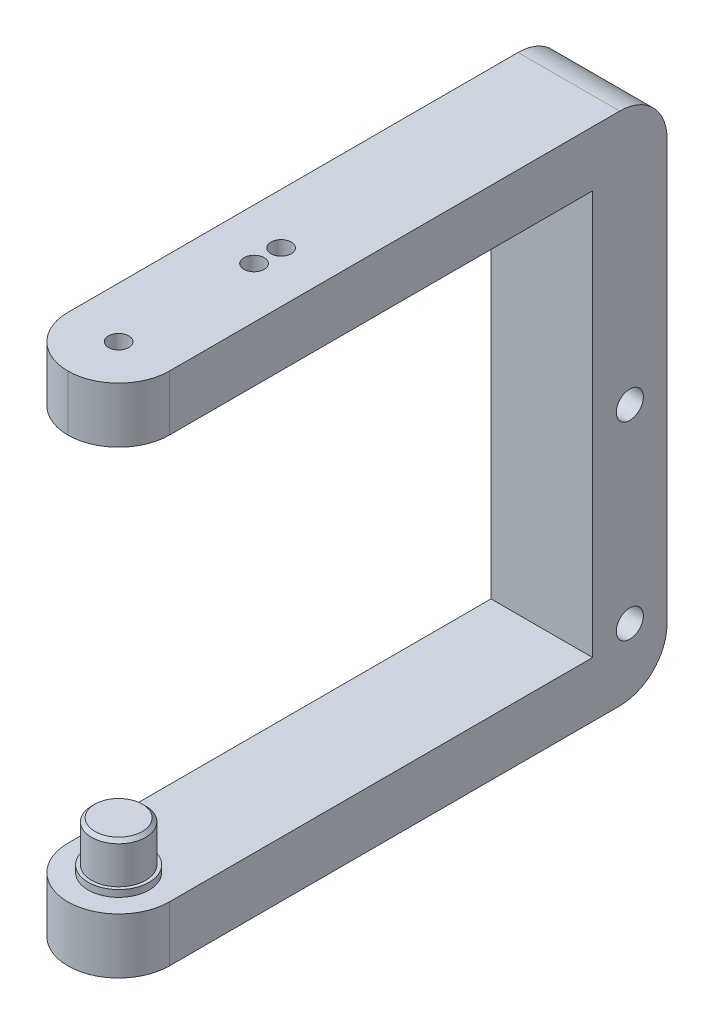
ISO-10303-21;
HEADER;
FILE_DESCRIPTION(('STEP AP214'),'2;1');
FILE_NAME('part.step','',(''),(''),'','','');
FILE_SCHEMA(('AUTOMOTIVE_DESIGN { 1 0 10303 214 1 1 1 1 }'));
ENDSEC;
DATA;
#1=APPLICATION_CONTEXT('core data for automotive mechanical design processes');
#2=APPLICATION_PROTOCOL_DEFINITION('international standard','automotive_design',2000,#1);
#3=PRODUCT_CONTEXT('',#1,'mechanical');
#4=PRODUCT('Part','Part','',(#3));
#5=PRODUCT_RELATED_PRODUCT_CATEGORY('part','',(#4));
#6=PRODUCT_DEFINITION_FORMATION('','',#4);
#7=PRODUCT_DEFINITION_CONTEXT('part definition',#1,'design');
#8=PRODUCT_DEFINITION('design','',#6,#7);
#9=PRODUCT_DEFINITION_SHAPE('','',#8);
#10=(LENGTH_UNIT() NAMED_UNIT(*) SI_UNIT(.MILLI.,.METRE.));
#11=(NAMED_UNIT(*) PLANE_ANGLE_UNIT() SI_UNIT($,.RADIAN.));
#12=(NAMED_UNIT(*) SI_UNIT($,.STERADIAN.) SOLID_ANGLE_UNIT());
#13=UNCERTAINTY_MEASURE_WITH_UNIT(LENGTH_MEASURE(1.E-05),#10,'distance_accuracy_value','');
#14=(GEOMETRIC_REPRESENTATION_CONTEXT(3) GLOBAL_UNCERTAINTY_ASSIGNED_CONTEXT((#13)) GLOBAL_UNIT_ASSIGNED_CONTEXT((#10,
#11,#12)) REPRESENTATION_CONTEXT('',''));
#15=CARTESIAN_POINT('',(0.,0.,0.));
#16=DIRECTION('',(0.,0.,1.));
#17=DIRECTION('',(1.,0.,0.));
#18=AXIS2_PLACEMENT_3D('',#15,#16,#17);
#19=CARTESIAN_POINT('',(0.,0.,11.));
#20=DIRECTION('',(0.,0.,1.));
#21=DIRECTION('',(1.,0.,0.));
#22=AXIS2_PLACEMENT_3D('',#19,#20,#21);
#23=PLANE('',#22);
#24=DIRECTION('',(0.,1.,0.));
#25=VECTOR('',#24,1.);
#26=CARTESIAN_POINT('',(15.,0.,11.));
#27=LINE('',#26,#25);
#28=CARTESIAN_POINT('',(15.,8.2,11.));
#29=VERTEX_POINT('',#28);
#30=CARTESIAN_POINT('',(15.,67.9,11.));
#31=VERTEX_POINT('',#30);
#32=EDGE_CURVE('E159',#29,#31,#27,.T.);
#33=ORIENTED_EDGE('',*,*,#32,.T.);
#34=DIRECTION('',(1.,0.,0.));
#35=VECTOR('',#34,1.);
#36=CARTESIAN_POINT('',(15.,67.9,11.));
#37=LINE('',#36,#35);
#38=CARTESIAN_POINT('',(0.,67.9,11.));
#39=VERTEX_POINT('',#38);
#40=EDGE_CURVE('E250',#39,#31,#37,.T.);
#41=ORIENTED_EDGE('',*,*,#40,.F.);
#42=DIRECTION('',(0.,-1.,0.));
#43=VECTOR('',#42,1.);
#44=CARTESIAN_POINT('',(0.,76.1,11.));
#45=LINE('',#44,#43);
#46=CARTESIAN_POINT('',(0.,8.2,11.));
#47=VERTEX_POINT('',#46);
#48=EDGE_CURVE('E157',#39,#47,#45,.T.);
#49=ORIENTED_EDGE('',*,*,#48,.T.);
#50=DIRECTION('',(-1.,0.,0.));
#51=VECTOR('',#50,1.);
#52=CARTESIAN_POINT('',(15.,8.2,11.));
#53=LINE('',#52,#51);
#54=EDGE_CURVE('E140',#29,#47,#53,.T.);
#55=ORIENTED_EDGE('',*,*,#54,.F.);
#56=EDGE_LOOP('',(#33,#41,#49,#55));
#57=FACE_BOUND('',#56,.T.);
#58=ADVANCED_FACE('F35',(#57),#23,.T.);
#59=CARTESIAN_POINT('',(0.,76.1,11.));
#60=DIRECTION('',(1.,0.,0.));
#61=DIRECTION('',(0.,0.,-1.));
#62=AXIS2_PLACEMENT_3D('',#59,#60,#61);
#63=PLANE('',#62);
#64=CARTESIAN_POINT('',(0.,9.8,5.50000000000001));
#65=DIRECTION('',(1.,0.,0.));
#66=DIRECTION('',(0.,0.,-1.));
#67=AXIS2_PLACEMENT_3D('',#64,#65,#66);
#68=CIRCLE('',#67,2.);
#69=CARTESIAN_POINT('',(0.,9.8,3.50000000000001));
#70=VERTEX_POINT('',#69);
#71=EDGE_CURVE('E220',#70,#70,#68,.T.);
#72=ORIENTED_EDGE('',*,*,#71,.T.);
#73=EDGE_LOOP('',(#72));
#74=FACE_BOUND('',#73,.T.);
#75=CARTESIAN_POINT('',(0.,37.8,5.5));
#76=DIRECTION('',(1.,0.,0.));
#77=DIRECTION('',(0.,0.,-1.));
#78=AXIS2_PLACEMENT_3D('',#75,#76,#77);
#79=CIRCLE('',#78,1.99999999999999);
#80=CARTESIAN_POINT('',(0.,37.8,3.5));
#81=VERTEX_POINT('',#80);
#82=EDGE_CURVE('E200',#81,#81,#79,.T.);
#83=ORIENTED_EDGE('',*,*,#82,.T.);
#84=EDGE_LOOP('',(#83));
#85=FACE_BOUND('',#84,.T.);
#86=DIRECTION('',(0.,-1.,0.));
#87=VECTOR('',#86,1.);
#88=CARTESIAN_POINT('',(0.,76.1,0.));
#89=LINE('',#88,#87);
#90=CARTESIAN_POINT('',(0.,69.1,0.));
#91=VERTEX_POINT('',#90);
#92=CARTESIAN_POINT('',(0.,7.00000000000001,0.));
#93=VERTEX_POINT('',#92);
#94=EDGE_CURVE('E156',#91,#93,#89,.T.);
#95=ORIENTED_EDGE('',*,*,#94,.T.);
#96=CARTESIAN_POINT('',(0.,7.,7.));
#97=DIRECTION('',(1.,0.,0.));
#98=DIRECTION('',(0.,0.,-1.));
#99=AXIS2_PLACEMENT_3D('',#96,#97,#98);
#100=CIRCLE('',#99,7.);
#101=CARTESIAN_POINT('',(0.,0.,7.));
#102=VERTEX_POINT('',#101);
#103=EDGE_CURVE('E211',#93,#102,#100,.F.);
#104=ORIENTED_EDGE('',*,*,#103,.T.);
#105=DIRECTION('',(0.,0.,-1.));
#106=VECTOR('',#105,1.);
#107=CARTESIAN_POINT('',(0.,0.,11.));
#108=LINE('',#107,#106);
#109=CARTESIAN_POINT('',(0.,0.,73.5));
#110=VERTEX_POINT('',#109);
#111=EDGE_CURVE('E127',#110,#102,#108,.T.);
#112=ORIENTED_EDGE('',*,*,#111,.F.);
#113=DIRECTION('',(0.,-1.,0.));
#114=VECTOR('',#113,1.);
#115=CARTESIAN_POINT('',(0.,8.2,73.5));
#116=LINE('',#115,#114);
#117=CARTESIAN_POINT('',(0.,8.2,73.5));
#118=VERTEX_POINT('',#117);
#119=EDGE_CURVE('E121',#118,#110,#116,.T.);
#120=ORIENTED_EDGE('',*,*,#119,.F.);
#121=DIRECTION('',(0.,0.,-1.));
#122=VECTOR('',#121,1.);
#123=CARTESIAN_POINT('',(0.,8.2,73.5));
#124=LINE('',#123,#122);
#125=EDGE_CURVE('E125',#118,#47,#124,.T.);
#126=ORIENTED_EDGE('',*,*,#125,.T.);
#127=ORIENTED_EDGE('',*,*,#48,.F.);
#128=DIRECTION('',(0.,0.,-1.));
#129=VECTOR('',#128,1.);
#130=CARTESIAN_POINT('',(0.,67.9,81.));
#131=LINE('',#130,#129);
#132=CARTESIAN_POINT('',(0.,67.9,73.5));
#133=VERTEX_POINT('',#132);
#134=EDGE_CURVE('E147',#133,#39,#131,.T.);
#135=ORIENTED_EDGE('',*,*,#134,.F.);
#136=DIRECTION('',(0.,-1.,0.));
#137=VECTOR('',#136,1.);
#138=CARTESIAN_POINT('',(0.,76.1,73.5));
#139=LINE('',#138,#137);
#140=CARTESIAN_POINT('',(0.,76.1,73.5));
#141=VERTEX_POINT('',#140);
#142=EDGE_CURVE('E193',#133,#141,#139,.F.);
#143=ORIENTED_EDGE('',*,*,#142,.T.);
#144=DIRECTION('',(0.,0.,-1.));
#145=VECTOR('',#144,1.);
#146=CARTESIAN_POINT('',(0.,76.1,11.));
#147=LINE('',#146,#145);
#148=CARTESIAN_POINT('',(0.,76.1,7.));
#149=VERTEX_POINT('',#148);
#150=EDGE_CURVE('E163',#141,#149,#147,.T.);
#151=ORIENTED_EDGE('',*,*,#150,.T.);
#152=CARTESIAN_POINT('',(0.,69.1,7.));
#153=DIRECTION('',(1.,0.,0.));
#154=DIRECTION('',(0.,0.,-1.));
#155=AXIS2_PLACEMENT_3D('',#152,#153,#154);
#156=CIRCLE('',#155,7.);
#157=EDGE_CURVE('E50',#149,#91,#156,.F.);
#158=ORIENTED_EDGE('',*,*,#157,.T.);
#159=EDGE_LOOP('',(#95,#104,#112,#120,#126,#127,#135,#143,#151,#158));
#160=FACE_BOUND('',#159,.T.);
#161=ADVANCED_FACE('F123',(#74,#85,#160),#63,.F.);
#162=CARTESIAN_POINT('',(0.,0.,11.));
#163=DIRECTION('',(0.,1.,0.));
#164=DIRECTION('',(0.,0.,1.));
#165=AXIS2_PLACEMENT_3D('',#162,#163,#164);
#166=PLANE('',#165);
#167=ORIENTED_EDGE('',*,*,#111,.T.);
#168=DIRECTION('',(1.,0.,0.));
#169=VECTOR('',#168,1.);
#170=CARTESIAN_POINT('',(0.,0.,7.));
#171=LINE('',#170,#169);
#172=CARTESIAN_POINT('',(15.,0.,7.));
#173=VERTEX_POINT('',#172);
#174=EDGE_CURVE('E195',#102,#173,#171,.T.);
#175=ORIENTED_EDGE('',*,*,#174,.T.);
#176=DIRECTION('',(0.,0.,-1.));
#177=VECTOR('',#176,1.);
#178=CARTESIAN_POINT('',(15.,0.,11.));
#179=LINE('',#178,#177);
#180=CARTESIAN_POINT('',(15.,0.,73.5));
#181=VERTEX_POINT('',#180);
#182=EDGE_CURVE('E172',#181,#173,#179,.T.);
#183=ORIENTED_EDGE('',*,*,#182,.F.);
#184=CARTESIAN_POINT('',(7.5,0.,73.5));
#185=DIRECTION('',(0.,1.,0.));
#186=DIRECTION('',(0.,0.,1.));
#187=AXIS2_PLACEMENT_3D('',#184,#185,#186);
#188=CIRCLE('',#187,7.5);
#189=EDGE_CURVE('E146',#110,#181,#188,.T.);
#190=ORIENTED_EDGE('',*,*,#189,.F.);
#191=EDGE_LOOP('',(#167,#175,#183,#190));
#192=FACE_BOUND('',#191,.T.);
#193=ADVANCED_FACE('F281',(#192),#166,.F.);
#194=CARTESIAN_POINT('',(15.,0.,11.));
#195=DIRECTION('',(-1.,0.,0.));
#196=DIRECTION('',(0.,0.,1.));
#197=AXIS2_PLACEMENT_3D('',#194,#195,#196);
#198=PLANE('',#197);
#199=CARTESIAN_POINT('',(15.,9.8,5.50000000000001));
#200=DIRECTION('',(1.,0.,0.));
#201=DIRECTION('',(0.,0.,-1.));
#202=AXIS2_PLACEMENT_3D('',#199,#200,#201);
#203=CIRCLE('',#202,2.);
#204=CARTESIAN_POINT('',(15.,9.8,3.50000000000001));
#205=VERTEX_POINT('',#204);
#206=EDGE_CURVE('E215',#205,#205,#203,.T.);
#207=ORIENTED_EDGE('',*,*,#206,.F.);
#208=EDGE_LOOP('',(#207));
#209=FACE_BOUND('',#208,.T.);
#210=CARTESIAN_POINT('',(15.,37.8,5.5));
#211=DIRECTION('',(1.,0.,0.));
#212=DIRECTION('',(0.,0.,-1.));
#213=AXIS2_PLACEMENT_3D('',#210,#211,#212);
#214=CIRCLE('',#213,2.);
#215=CARTESIAN_POINT('',(15.,37.8,3.5));
#216=VERTEX_POINT('',#215);
#217=EDGE_CURVE('E234',#216,#216,#214,.T.);
#218=ORIENTED_EDGE('',*,*,#217,.F.);
#219=EDGE_LOOP('',(#218));
#220=FACE_BOUND('',#219,.T.);
#221=ORIENTED_EDGE('',*,*,#182,.T.);
#222=CARTESIAN_POINT('',(15.,7.,7.));
#223=DIRECTION('',(-1.,0.,0.));
#224=DIRECTION('',(0.,0.,1.));
#225=AXIS2_PLACEMENT_3D('',#222,#223,#224);
#226=CIRCLE('',#225,7.);
#227=CARTESIAN_POINT('',(15.,7.,0.));
#228=VERTEX_POINT('',#227);
#229=EDGE_CURVE('E205',#173,#228,#226,.F.);
#230=ORIENTED_EDGE('',*,*,#229,.T.);
#231=DIRECTION('',(0.,1.,0.));
#232=VECTOR('',#231,1.);
#233=CARTESIAN_POINT('',(15.,0.,0.));
#234=LINE('',#233,#232);
#235=CARTESIAN_POINT('',(15.,69.1,0.));
#236=VERTEX_POINT('',#235);
#237=EDGE_CURVE('E160',#228,#236,#234,.T.);
#238=ORIENTED_EDGE('',*,*,#237,.T.);
#239=CARTESIAN_POINT('',(15.,69.1,7.));
#240=DIRECTION('',(-1.,0.,0.));
#241=DIRECTION('',(0.,0.,1.));
#242=AXIS2_PLACEMENT_3D('',#239,#240,#241);
#243=CIRCLE('',#242,7.);
#244=CARTESIAN_POINT('',(15.,76.1,7.));
#245=VERTEX_POINT('',#244);
#246=EDGE_CURVE('E203',#236,#245,#243,.F.);
#247=ORIENTED_EDGE('',*,*,#246,.T.);
#248=DIRECTION('',(0.,0.,-1.));
#249=VECTOR('',#248,1.);
#250=CARTESIAN_POINT('',(15.,76.1,11.));
#251=LINE('',#250,#249);
#252=CARTESIAN_POINT('',(15.,76.1,73.5));
#253=VERTEX_POINT('',#252);
#254=EDGE_CURVE('E169',#253,#245,#251,.T.);
#255=ORIENTED_EDGE('',*,*,#254,.F.);
#256=DIRECTION('',(0.,1.,0.));
#257=VECTOR('',#256,1.);
#258=CARTESIAN_POINT('',(15.,0.,73.5));
#259=LINE('',#258,#257);
#260=CARTESIAN_POINT('',(15.,67.9,73.5));
#261=VERTEX_POINT('',#260);
#262=EDGE_CURVE('E186',#253,#261,#259,.F.);
#263=ORIENTED_EDGE('',*,*,#262,.T.);
#264=DIRECTION('',(0.,0.,-1.));
#265=VECTOR('',#264,1.);
#266=CARTESIAN_POINT('',(15.,67.9,81.));
#267=LINE('',#266,#265);
#268=EDGE_CURVE('E150',#261,#31,#267,.T.);
#269=ORIENTED_EDGE('',*,*,#268,.T.);
#270=ORIENTED_EDGE('',*,*,#32,.F.);
#271=DIRECTION('',(0.,0.,-1.));
#272=VECTOR('',#271,1.);
#273=CARTESIAN_POINT('',(15.,8.2,73.5));
#274=LINE('',#273,#272);
#275=CARTESIAN_POINT('',(15.,8.2,73.5));
#276=VERTEX_POINT('',#275);
#277=EDGE_CURVE('E141',#276,#29,#274,.T.);
#278=ORIENTED_EDGE('',*,*,#277,.F.);
#279=DIRECTION('',(0.,1.,0.));
#280=VECTOR('',#279,1.);
#281=CARTESIAN_POINT('',(15.,0.,73.5));
#282=LINE('',#281,#280);
#283=EDGE_CURVE('E132',#181,#276,#282,.T.);
#284=ORIENTED_EDGE('',*,*,#283,.F.);
#285=EDGE_LOOP('',(#221,#230,#238,#247,#255,#263,#269,#270,#278,#284));
#286=FACE_BOUND('',#285,.T.);
#287=ADVANCED_FACE('F256',(#209,#220,#286),#198,.F.);
#288=CARTESIAN_POINT('',(15.,76.1,11.));
#289=DIRECTION('',(0.,-1.,0.));
#290=DIRECTION('',(0.,0.,-1.));
#291=AXIS2_PLACEMENT_3D('',#288,#289,#290);
#292=PLANE('',#291);
#293=CARTESIAN_POINT('',(7.5,76.1,73.5));
#294=DIRECTION('',(0.,1.,0.));
#295=DIRECTION('',(0.,0.,1.));
#296=AXIS2_PLACEMENT_3D('',#293,#294,#295);
#297=CIRCLE('',#296,1.49999999999999);
#298=CARTESIAN_POINT('',(7.5,76.1,75.));
#299=VERTEX_POINT('',#298);
#300=EDGE_CURVE('E228',#299,#299,#297,.T.);
#301=ORIENTED_EDGE('',*,*,#300,.F.);
#302=EDGE_LOOP('',(#301));
#303=FACE_BOUND('',#302,.T.);
#304=CARTESIAN_POINT('',(7.5,76.1,49.5));
#305=DIRECTION('',(0.,1.,0.));
#306=DIRECTION('',(0.,0.,1.));
#307=AXIS2_PLACEMENT_3D('',#304,#305,#306);
#308=CIRCLE('',#307,1.5);
#309=CARTESIAN_POINT('',(7.5,76.1,51.));
#310=VERTEX_POINT('',#309);
#311=EDGE_CURVE('E199',#310,#310,#308,.T.);
#312=ORIENTED_EDGE('',*,*,#311,.F.);
#313=EDGE_LOOP('',(#312));
#314=FACE_BOUND('',#313,.T.);
#315=CARTESIAN_POINT('',(7.5,76.1,53.5));
#316=DIRECTION('',(0.,1.,0.));
#317=DIRECTION('',(0.,0.,1.));
#318=AXIS2_PLACEMENT_3D('',#315,#316,#317);
#319=CIRCLE('',#318,1.5);
#320=CARTESIAN_POINT('',(7.5,76.1,55.));
#321=VERTEX_POINT('',#320);
#322=EDGE_CURVE('E244',#321,#321,#319,.T.);
#323=ORIENTED_EDGE('',*,*,#322,.F.);
#324=EDGE_LOOP('',(#323));
#325=FACE_BOUND('',#324,.T.);
#326=ORIENTED_EDGE('',*,*,#254,.T.);
#327=DIRECTION('',(-1.,0.,0.));
#328=VECTOR('',#327,1.);
#329=CARTESIAN_POINT('',(15.,76.1,7.));
#330=LINE('',#329,#328);
#331=EDGE_CURVE('E43',#245,#149,#330,.T.);
#332=ORIENTED_EDGE('',*,*,#331,.T.);
#333=ORIENTED_EDGE('',*,*,#150,.F.);
#334=CARTESIAN_POINT('',(7.5,76.1,73.5));
#335=DIRECTION('',(0.,-1.,0.));
#336=DIRECTION('',(0.,0.,-1.));
#337=AXIS2_PLACEMENT_3D('',#334,#335,#336);
#338=CIRCLE('',#337,7.5);
#339=CARTESIAN_POINT('',(7.5,76.1,81.));
#340=VERTEX_POINT('',#339);
#341=EDGE_CURVE('E182',#141,#340,#338,.F.);
#342=ORIENTED_EDGE('',*,*,#341,.T.);
#343=CARTESIAN_POINT('',(7.5,76.1,73.5));
#344=DIRECTION('',(0.,-1.,0.));
#345=DIRECTION('',(0.,0.,-1.));
#346=AXIS2_PLACEMENT_3D('',#343,#344,#345);
#347=CIRCLE('',#346,7.5);
#348=EDGE_CURVE('E184',#340,#253,#347,.F.);
#349=ORIENTED_EDGE('',*,*,#348,.T.);
#350=EDGE_LOOP('',(#326,#332,#333,#342,#349));
#351=FACE_BOUND('',#350,.T.);
#352=ADVANCED_FACE('F273',(#303,#314,#325,#351),#292,.F.);
#353=CARTESIAN_POINT('',(0.,0.,0.));
#354=DIRECTION('',(0.,0.,1.));
#355=DIRECTION('',(1.,0.,0.));
#356=AXIS2_PLACEMENT_3D('',#353,#354,#355);
#357=PLANE('',#356);
#358=ORIENTED_EDGE('',*,*,#237,.F.);
#359=DIRECTION('',(1.,0.,0.));
#360=VECTOR('',#359,1.);
#361=CARTESIAN_POINT('',(0.,7.,0.));
#362=LINE('',#361,#360);
#363=EDGE_CURVE('E58',#228,#93,#362,.F.);
#364=ORIENTED_EDGE('',*,*,#363,.T.);
#365=ORIENTED_EDGE('',*,*,#94,.F.);
#366=DIRECTION('',(-1.,0.,0.));
#367=VECTOR('',#366,1.);
#368=CARTESIAN_POINT('',(0.,69.1,0.));
#369=LINE('',#368,#367);
#370=EDGE_CURVE('E207',#91,#236,#369,.F.);
#371=ORIENTED_EDGE('',*,*,#370,.T.);
#372=EDGE_LOOP('',(#358,#364,#365,#371));
#373=FACE_BOUND('',#372,.T.);
#374=ADVANCED_FACE('F275',(#373),#357,.F.);
#375=CARTESIAN_POINT('',(15.,8.2,73.5));
#376=DIRECTION('',(0.,-1.,0.));
#377=DIRECTION('',(0.,0.,-1.));
#378=AXIS2_PLACEMENT_3D('',#375,#376,#377);
#379=PLANE('',#378);
#380=CARTESIAN_POINT('',(7.5,8.2,73.5));
#381=DIRECTION('',(0.,-1.,0.));
#382=DIRECTION('',(0.,0.,-1.));
#383=AXIS2_PLACEMENT_3D('',#380,#381,#382);
#384=CIRCLE('',#383,4.5);
#385=CARTESIAN_POINT('',(7.5,8.2,69.));
#386=VERTEX_POINT('',#385);
#387=EDGE_CURVE('E11',#386,#386,#384,.F.);
#388=ORIENTED_EDGE('',*,*,#387,.F.);
#389=EDGE_LOOP('',(#388));
#390=FACE_BOUND('',#389,.T.);
#391=ORIENTED_EDGE('',*,*,#125,.F.);
#392=CARTESIAN_POINT('',(7.5,8.2,73.5));
#393=DIRECTION('',(0.,1.,0.));
#394=DIRECTION('',(0.,0.,1.));
#395=AXIS2_PLACEMENT_3D('',#392,#393,#394);
#396=CIRCLE('',#395,7.5);
#397=EDGE_CURVE('E139',#118,#276,#396,.T.);
#398=ORIENTED_EDGE('',*,*,#397,.T.);
#399=ORIENTED_EDGE('',*,*,#277,.T.);
#400=ORIENTED_EDGE('',*,*,#54,.T.);
#401=EDGE_LOOP('',(#391,#398,#399,#400));
#402=FACE_BOUND('',#401,.T.);
#403=ADVANCED_FACE('F137',(#390,#402),#379,.F.);
#404=CARTESIAN_POINT('',(7.5,0.,73.5));
#405=DIRECTION('',(0.,1.,0.));
#406=DIRECTION('',(0.,0.,1.));
#407=AXIS2_PLACEMENT_3D('',#404,#405,#406);
#408=CYLINDRICAL_SURFACE('',#407,7.5);
#409=ORIENTED_EDGE('',*,*,#189,.T.);
#410=ORIENTED_EDGE('',*,*,#283,.T.);
#411=ORIENTED_EDGE('',*,*,#397,.F.);
#412=ORIENTED_EDGE('',*,*,#119,.T.);
#413=EDGE_LOOP('',(#409,#410,#411,#412));
#414=FACE_BOUND('',#413,.T.);
#415=ADVANCED_FACE('F144',(#414),#408,.T.);
#416=CARTESIAN_POINT('',(15.,67.9,81.));
#417=DIRECTION('',(0.,1.,0.));
#418=DIRECTION('',(0.,0.,1.));
#419=AXIS2_PLACEMENT_3D('',#416,#417,#418);
#420=PLANE('',#419);
#421=CARTESIAN_POINT('',(7.5,67.9,73.5));
#422=DIRECTION('',(0.,1.,0.));
#423=DIRECTION('',(0.,0.,1.));
#424=AXIS2_PLACEMENT_3D('',#421,#422,#423);
#425=CIRCLE('',#424,1.49999999999999);
#426=CARTESIAN_POINT('',(7.5,67.9,75.));
#427=VERTEX_POINT('',#426);
#428=EDGE_CURVE('E223',#427,#427,#425,.T.);
#429=ORIENTED_EDGE('',*,*,#428,.T.);
#430=EDGE_LOOP('',(#429));
#431=FACE_BOUND('',#430,.T.);
#432=CARTESIAN_POINT('',(7.5,67.9,49.5));
#433=DIRECTION('',(0.,1.,0.));
#434=DIRECTION('',(0.,0.,1.));
#435=AXIS2_PLACEMENT_3D('',#432,#433,#434);
#436=CIRCLE('',#435,1.5);
#437=CARTESIAN_POINT('',(7.5,67.9,51.));
#438=VERTEX_POINT('',#437);
#439=EDGE_CURVE('E241',#438,#438,#436,.T.);
#440=ORIENTED_EDGE('',*,*,#439,.T.);
#441=EDGE_LOOP('',(#440));
#442=FACE_BOUND('',#441,.T.);
#443=CARTESIAN_POINT('',(7.5,67.9,53.5));
#444=DIRECTION('',(0.,1.,0.));
#445=DIRECTION('',(0.,0.,1.));
#446=AXIS2_PLACEMENT_3D('',#443,#444,#445);
#447=CIRCLE('',#446,1.5);
#448=CARTESIAN_POINT('',(7.5,67.9,55.));
#449=VERTEX_POINT('',#448);
#450=EDGE_CURVE('E247',#449,#449,#447,.T.);
#451=ORIENTED_EDGE('',*,*,#450,.T.);
#452=EDGE_LOOP('',(#451));
#453=FACE_BOUND('',#452,.T.);
#454=ORIENTED_EDGE('',*,*,#268,.F.);
#455=CARTESIAN_POINT('',(7.5,67.9,73.5));
#456=DIRECTION('',(0.,1.,0.));
#457=DIRECTION('',(0.,0.,1.));
#458=AXIS2_PLACEMENT_3D('',#455,#456,#457);
#459=CIRCLE('',#458,7.5);
#460=CARTESIAN_POINT('',(7.5,67.9,81.));
#461=VERTEX_POINT('',#460);
#462=EDGE_CURVE('E191',#261,#461,#459,.F.);
#463=ORIENTED_EDGE('',*,*,#462,.T.);
#464=CARTESIAN_POINT('',(7.5,67.9,73.5));
#465=DIRECTION('',(0.,1.,0.));
#466=DIRECTION('',(0.,0.,1.));
#467=AXIS2_PLACEMENT_3D('',#464,#465,#466);
#468=CIRCLE('',#467,7.5);
#469=EDGE_CURVE('E189',#461,#133,#468,.F.);
#470=ORIENTED_EDGE('',*,*,#469,.T.);
#471=ORIENTED_EDGE('',*,*,#134,.T.);
#472=ORIENTED_EDGE('',*,*,#40,.T.);
#473=EDGE_LOOP('',(#454,#463,#470,#471,#472));
#474=FACE_BOUND('',#473,.T.);
#475=ADVANCED_FACE('F262',(#431,#442,#453,#474),#420,.F.);
#476=CARTESIAN_POINT('',(7.5,76.1,53.5));
#477=DIRECTION('',(0.,1.,0.));
#478=DIRECTION('',(0.,0.,1.));
#479=AXIS2_PLACEMENT_3D('',#476,#477,#478);
#480=CYLINDRICAL_SURFACE('',#479,1.5);
#481=ORIENTED_EDGE('',*,*,#322,.T.);
#482=EDGE_LOOP('',(#481));
#483=FACE_BOUND('',#482,.T.);
#484=ORIENTED_EDGE('',*,*,#450,.F.);
#485=EDGE_LOOP('',(#484));
#486=FACE_BOUND('',#485,.T.);
#487=ADVANCED_FACE('F312',(#483,#486),#480,.F.);
#488=CARTESIAN_POINT('',(7.5,76.1,49.5));
#489=DIRECTION('',(0.,1.,0.));
#490=DIRECTION('',(0.,0.,1.));
#491=AXIS2_PLACEMENT_3D('',#488,#489,#490);
#492=CYLINDRICAL_SURFACE('',#491,1.5);
#493=ORIENTED_EDGE('',*,*,#311,.T.);
#494=EDGE_LOOP('',(#493));
#495=FACE_BOUND('',#494,.T.);
#496=ORIENTED_EDGE('',*,*,#439,.F.);
#497=EDGE_LOOP('',(#496));
#498=FACE_BOUND('',#497,.T.);
#499=ADVANCED_FACE('F315',(#495,#498),#492,.F.);
#500=CARTESIAN_POINT('',(7.5,0.,73.5));
#501=DIRECTION('',(0.,-1.,0.));
#502=DIRECTION('',(0.,0.,-1.));
#503=AXIS2_PLACEMENT_3D('',#500,#501,#502);
#504=CYLINDRICAL_SURFACE('',#503,7.5);
#505=ORIENTED_EDGE('',*,*,#142,.F.);
#506=ORIENTED_EDGE('',*,*,#469,.F.);
#507=DIRECTION('',(0.,-1.,0.));
#508=VECTOR('',#507,1.);
#509=CARTESIAN_POINT('',(7.5,0.,81.));
#510=LINE('',#509,#508);
#511=EDGE_CURVE('E196',#340,#461,#510,.T.);
#512=ORIENTED_EDGE('',*,*,#511,.F.);
#513=ORIENTED_EDGE('',*,*,#341,.F.);
#514=EDGE_LOOP('',(#505,#506,#512,#513));
#515=FACE_BOUND('',#514,.T.);
#516=ADVANCED_FACE('F269',(#515),#504,.T.);
#517=CARTESIAN_POINT('',(7.5,0.,73.5));
#518=DIRECTION('',(0.,1.,0.));
#519=DIRECTION('',(0.,0.,1.));
#520=AXIS2_PLACEMENT_3D('',#517,#518,#519);
#521=CYLINDRICAL_SURFACE('',#520,7.5);
#522=ORIENTED_EDGE('',*,*,#462,.F.);
#523=ORIENTED_EDGE('',*,*,#262,.F.);
#524=ORIENTED_EDGE('',*,*,#348,.F.);
#525=ORIENTED_EDGE('',*,*,#511,.T.);
#526=EDGE_LOOP('',(#522,#523,#524,#525));
#527=FACE_BOUND('',#526,.T.);
#528=ADVANCED_FACE('F352',(#527),#521,.T.);
#529=CARTESIAN_POINT('',(0.,7.,7.));
#530=DIRECTION('',(1.,0.,0.));
#531=DIRECTION('',(0.,0.,-1.));
#532=AXIS2_PLACEMENT_3D('',#529,#530,#531);
#533=CYLINDRICAL_SURFACE('',#532,7.);
#534=ORIENTED_EDGE('',*,*,#103,.F.);
#535=ORIENTED_EDGE('',*,*,#363,.F.);
#536=ORIENTED_EDGE('',*,*,#229,.F.);
#537=ORIENTED_EDGE('',*,*,#174,.F.);
#538=EDGE_LOOP('',(#534,#535,#536,#537));
#539=FACE_BOUND('',#538,.T.);
#540=ADVANCED_FACE('F278',(#539),#533,.T.);
#541=CARTESIAN_POINT('',(15.,69.1,7.));
#542=DIRECTION('',(-1.,0.,0.));
#543=DIRECTION('',(0.,0.,1.));
#544=AXIS2_PLACEMENT_3D('',#541,#542,#543);
#545=CYLINDRICAL_SURFACE('',#544,7.);
#546=ORIENTED_EDGE('',*,*,#246,.F.);
#547=ORIENTED_EDGE('',*,*,#370,.F.);
#548=ORIENTED_EDGE('',*,*,#157,.F.);
#549=ORIENTED_EDGE('',*,*,#331,.F.);
#550=EDGE_LOOP('',(#546,#547,#548,#549));
#551=FACE_BOUND('',#550,.T.);
#552=ADVANCED_FACE('F37',(#551),#545,.T.);
#553=CARTESIAN_POINT('',(15.,37.8,5.5));
#554=DIRECTION('',(1.,0.,0.));
#555=DIRECTION('',(0.,0.,-1.));
#556=AXIS2_PLACEMENT_3D('',#553,#554,#555);
#557=CYLINDRICAL_SURFACE('',#556,2.);
#558=ORIENTED_EDGE('',*,*,#82,.F.);
#559=EDGE_LOOP('',(#558));
#560=FACE_BOUND('',#559,.T.);
#561=ORIENTED_EDGE('',*,*,#217,.T.);
#562=EDGE_LOOP('',(#561));
#563=FACE_BOUND('',#562,.T.);
#564=ADVANCED_FACE('F361',(#560,#563),#557,.F.);
#565=CARTESIAN_POINT('',(15.,9.8,5.50000000000001));
#566=DIRECTION('',(1.,0.,0.));
#567=DIRECTION('',(0.,0.,-1.));
#568=AXIS2_PLACEMENT_3D('',#565,#566,#567);
#569=CYLINDRICAL_SURFACE('',#568,2.);
#570=ORIENTED_EDGE('',*,*,#71,.F.);
#571=EDGE_LOOP('',(#570));
#572=FACE_BOUND('',#571,.T.);
#573=ORIENTED_EDGE('',*,*,#206,.T.);
#574=EDGE_LOOP('',(#573));
#575=FACE_BOUND('',#574,.T.);
#576=ADVANCED_FACE('F365',(#572,#575),#569,.F.);
#577=CARTESIAN_POINT('',(7.5,9.2,73.5));
#578=DIRECTION('',(0.,-1.,0.));
#579=DIRECTION('',(0.,0.,-1.));
#580=AXIS2_PLACEMENT_3D('',#577,#578,#579);
#581=CYLINDRICAL_SURFACE('',#580,4.5);
#582=CARTESIAN_POINT('',(7.5,9.2,73.5));
#583=DIRECTION('',(0.,1.,0.));
#584=DIRECTION('',(0.,0.,1.));
#585=AXIS2_PLACEMENT_3D('',#582,#583,#584);
#586=CIRCLE('',#585,4.5);
#587=CARTESIAN_POINT('',(7.5,9.2,78.));
#588=VERTEX_POINT('',#587);
#589=EDGE_CURVE('E216',#588,#588,#586,.T.);
#590=ORIENTED_EDGE('',*,*,#589,.F.);
#591=EDGE_LOOP('',(#590));
#592=FACE_BOUND('',#591,.T.);
#593=ORIENTED_EDGE('',*,*,#387,.T.);
#594=EDGE_LOOP('',(#593));
#595=FACE_BOUND('',#594,.T.);
#596=ADVANCED_FACE('F371',(#592,#595),#581,.T.);
#597=CARTESIAN_POINT('',(7.5,9.2,73.5));
#598=DIRECTION('',(0.,1.,0.));
#599=DIRECTION('',(0.,0.,1.));
#600=AXIS2_PLACEMENT_3D('',#597,#598,#599);
#601=PLANE('',#600);
#602=CARTESIAN_POINT('',(7.5,9.2,73.5));
#603=DIRECTION('',(0.,1.,0.));
#604=DIRECTION('',(0.,0.,1.));
#605=AXIS2_PLACEMENT_3D('',#602,#603,#604);
#606=CIRCLE('',#605,4.);
#607=CARTESIAN_POINT('',(7.5,9.2,77.5));
#608=VERTEX_POINT('',#607);
#609=EDGE_CURVE('E213',#608,#608,#606,.T.);
#610=ORIENTED_EDGE('',*,*,#609,.F.);
#611=EDGE_LOOP('',(#610));
#612=FACE_BOUND('',#611,.T.);
#613=ORIENTED_EDGE('',*,*,#589,.T.);
#614=EDGE_LOOP('',(#613));
#615=FACE_BOUND('',#614,.T.);
#616=ADVANCED_FACE('F332',(#612,#615),#601,.T.);
#617=CARTESIAN_POINT('',(7.5,15.2,73.5));
#618=DIRECTION('',(0.,1.,0.));
#619=DIRECTION('',(0.,0.,1.));
#620=AXIS2_PLACEMENT_3D('',#617,#618,#619);
#621=PLANE('',#620);
#622=CARTESIAN_POINT('',(7.5,15.2,73.5));
#623=DIRECTION('',(0.,1.,0.));
#624=DIRECTION('',(0.,0.,1.));
#625=AXIS2_PLACEMENT_3D('',#622,#623,#624);
#626=CIRCLE('',#625,3.5);
#627=CARTESIAN_POINT('',(7.5,15.2,77.));
#628=VERTEX_POINT('',#627);
#629=EDGE_CURVE('E176',#628,#628,#626,.T.);
#630=ORIENTED_EDGE('',*,*,#629,.T.);
#631=EDGE_LOOP('',(#630));
#632=FACE_BOUND('',#631,.T.);
#633=ADVANCED_FACE('F328',(#632),#621,.T.);
#634=CARTESIAN_POINT('',(7.5,15.2,73.5));
#635=DIRECTION('',(0.,-1.,0.));
#636=DIRECTION('',(0.,0.,-1.));
#637=AXIS2_PLACEMENT_3D('',#634,#635,#636);
#638=CONICAL_SURFACE('',#637,3.5,0.785398163397447);
#639=CARTESIAN_POINT('',(7.5,14.7,73.5));
#640=DIRECTION('',(0.,1.,0.));
#641=DIRECTION('',(0.,0.,1.));
#642=AXIS2_PLACEMENT_3D('',#639,#640,#641);
#643=CIRCLE('',#642,4.);
#644=CARTESIAN_POINT('',(7.5,14.7,77.5));
#645=VERTEX_POINT('',#644);
#646=EDGE_CURVE('E179',#645,#645,#643,.F.);
#647=ORIENTED_EDGE('',*,*,#646,.F.);
#648=EDGE_LOOP('',(#647));
#649=FACE_BOUND('',#648,.T.);
#650=ORIENTED_EDGE('',*,*,#629,.F.);
#651=EDGE_LOOP('',(#650));
#652=FACE_BOUND('',#651,.T.);
#653=ADVANCED_FACE('F331',(#649,#652),#638,.T.);
#654=CARTESIAN_POINT('',(7.5,15.2,73.5));
#655=DIRECTION('',(0.,-1.,0.));
#656=DIRECTION('',(0.,0.,-1.));
#657=AXIS2_PLACEMENT_3D('',#654,#655,#656);
#658=CYLINDRICAL_SURFACE('',#657,4.);
#659=ORIENTED_EDGE('',*,*,#609,.T.);
#660=EDGE_LOOP('',(#659));
#661=FACE_BOUND('',#660,.T.);
#662=ORIENTED_EDGE('',*,*,#646,.T.);
#663=EDGE_LOOP('',(#662));
#664=FACE_BOUND('',#663,.T.);
#665=ADVANCED_FACE('F334',(#661,#664),#658,.T.);
#666=CARTESIAN_POINT('',(7.5,76.1,73.5));
#667=DIRECTION('',(0.,1.,0.));
#668=DIRECTION('',(0.,0.,1.));
#669=AXIS2_PLACEMENT_3D('',#666,#667,#668);
#670=CYLINDRICAL_SURFACE('',#669,1.49999999999999);
#671=ORIENTED_EDGE('',*,*,#428,.F.);
#672=EDGE_LOOP('',(#671));
#673=FACE_BOUND('',#672,.T.);
#674=ORIENTED_EDGE('',*,*,#300,.T.);
#675=EDGE_LOOP('',(#674));
#676=FACE_BOUND('',#675,.T.);
#677=ADVANCED_FACE('F336',(#673,#676),#670,.F.);
#678=CLOSED_SHELL('',(#58,#161,#193,#287,#352,#374,#403,#415,#475,#487,#499,#516,#528,#540,#552,
#564,#576,#596,#616,#633,#653,#665,#677));
#679=MANIFOLD_SOLID_BREP('B2',#678);
#680=ADVANCED_BREP_SHAPE_REPRESENTATION('',(#18,#679),#14);
#681=SHAPE_DEFINITION_REPRESENTATION(#9,#680);
ENDSEC;
END-ISO-10303-21;
